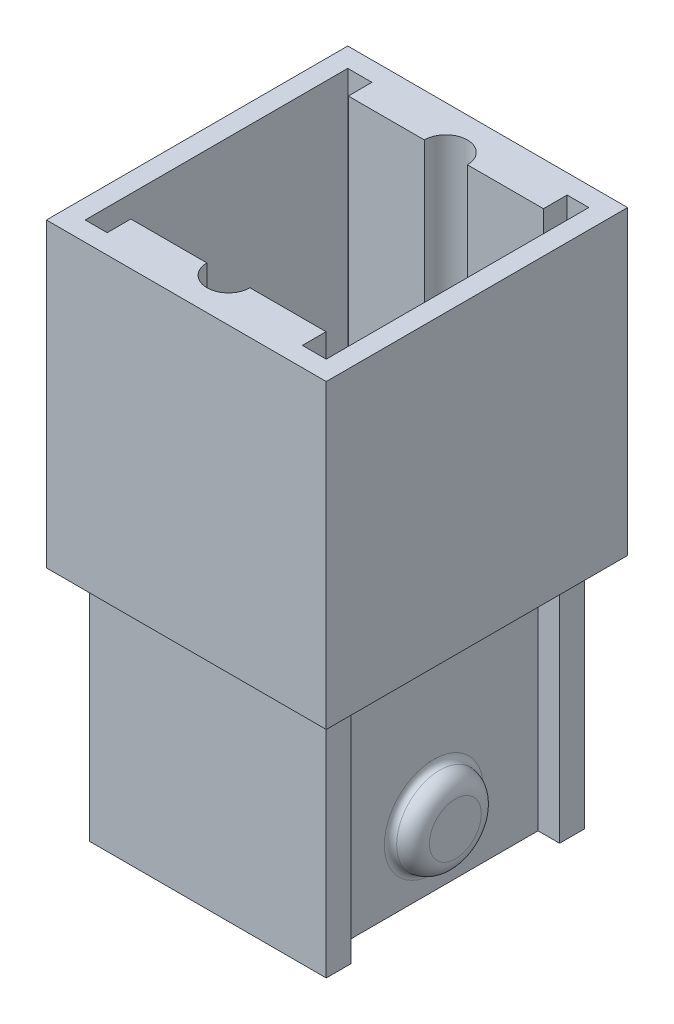
ISO-10303-21;
HEADER;
FILE_DESCRIPTION(('STEP AP214'),'2;1');
FILE_NAME('part.step','',(''),(''),'','','');
FILE_SCHEMA(('AUTOMOTIVE_DESIGN { 1 0 10303 214 1 1 1 1 }'));
ENDSEC;
DATA;
#1=APPLICATION_CONTEXT('core data for automotive mechanical design processes');
#2=APPLICATION_PROTOCOL_DEFINITION('international standard','automotive_design',2000,#1);
#3=PRODUCT_CONTEXT('',#1,'mechanical');
#4=PRODUCT('Part','Part','',(#3));
#5=PRODUCT_RELATED_PRODUCT_CATEGORY('part','',(#4));
#6=PRODUCT_DEFINITION_FORMATION('','',#4);
#7=PRODUCT_DEFINITION_CONTEXT('part definition',#1,'design');
#8=PRODUCT_DEFINITION('design','',#6,#7);
#9=PRODUCT_DEFINITION_SHAPE('','',#8);
#10=(LENGTH_UNIT() NAMED_UNIT(*) SI_UNIT(.MILLI.,.METRE.));
#11=(NAMED_UNIT(*) PLANE_ANGLE_UNIT() SI_UNIT($,.RADIAN.));
#12=(NAMED_UNIT(*) SI_UNIT($,.STERADIAN.) SOLID_ANGLE_UNIT());
#13=UNCERTAINTY_MEASURE_WITH_UNIT(LENGTH_MEASURE(1.E-05),#10,'distance_accuracy_value','');
#14=(GEOMETRIC_REPRESENTATION_CONTEXT(3) GLOBAL_UNCERTAINTY_ASSIGNED_CONTEXT((#13)) GLOBAL_UNIT_ASSIGNED_CONTEXT((#10,
#11,#12)) REPRESENTATION_CONTEXT('',''));
#15=CARTESIAN_POINT('',(0.,0.,0.));
#16=DIRECTION('',(0.,0.,1.));
#17=DIRECTION('',(1.,0.,0.));
#18=AXIS2_PLACEMENT_3D('',#15,#16,#17);
#19=CARTESIAN_POINT('',(5.04572989807048,6.5,-5.5));
#20=DIRECTION('',(0.,0.,-1.));
#21=DIRECTION('',(-1.,0.,0.));
#22=AXIS2_PLACEMENT_3D('',#19,#20,#21);
#23=PLANE('',#22);
#24=DIRECTION('',(-1.,0.,0.));
#25=VECTOR('',#24,1.);
#26=CARTESIAN_POINT('',(5.04572989807048,6.5,-5.5));
#27=LINE('',#26,#25);
#28=CARTESIAN_POINT('',(2.27869662372588,6.5,-5.5));
#29=VERTEX_POINT('',#28);
#30=CARTESIAN_POINT('',(0.511663349381284,6.5,-5.5));
#31=VERTEX_POINT('',#30);
#32=EDGE_CURVE('E299',#29,#31,#27,.T.);
#33=ORIENTED_EDGE('',*,*,#32,.F.);
#34=DIRECTION('',(0.,1.,0.));
#35=VECTOR('',#34,1.);
#36=CARTESIAN_POINT('',(2.27869662372588,6.5,-5.5));
#37=LINE('',#36,#35);
#38=CARTESIAN_POINT('',(2.27869662372588,12.5,-5.5));
#39=VERTEX_POINT('',#38);
#40=EDGE_CURVE('E316',#29,#39,#37,.T.);
#41=ORIENTED_EDGE('',*,*,#40,.T.);
#42=DIRECTION('',(-1.,0.,0.));
#43=VECTOR('',#42,1.);
#44=CARTESIAN_POINT('',(5.04572989807048,12.5,-5.5));
#45=LINE('',#44,#43);
#46=CARTESIAN_POINT('',(0.511663349381284,12.5,-5.5));
#47=VERTEX_POINT('',#46);
#48=EDGE_CURVE('E347',#39,#47,#45,.T.);
#49=ORIENTED_EDGE('',*,*,#48,.T.);
#50=DIRECTION('',(0.,1.,0.));
#51=VECTOR('',#50,1.);
#52=CARTESIAN_POINT('',(0.511663349381284,6.5,-5.5));
#53=LINE('',#52,#51);
#54=EDGE_CURVE('E368',#31,#47,#53,.T.);
#55=ORIENTED_EDGE('',*,*,#54,.F.);
#56=EDGE_LOOP('',(#33,#41,#49,#55));
#57=FACE_BOUND('',#56,.T.);
#58=ADVANCED_FACE('F40',(#57),#23,.F.);
#59=CARTESIAN_POINT('',(0.461663349381285,6.5,-0.5));
#60=DIRECTION('',(0.,0.,1.));
#61=DIRECTION('',(1.,0.,0.));
#62=AXIS2_PLACEMENT_3D('',#59,#60,#61);
#63=PLANE('',#62);
#64=DIRECTION('',(1.,0.,0.));
#65=VECTOR('',#64,1.);
#66=CARTESIAN_POINT('',(0.461663349381285,6.5,-0.5));
#67=LINE('',#66,#65);
#68=CARTESIAN_POINT('',(3.22869662372588,6.5,-0.5));
#69=VERTEX_POINT('',#68);
#70=CARTESIAN_POINT('',(4.99572989807048,6.5,-0.5));
#71=VERTEX_POINT('',#70);
#72=EDGE_CURVE('E274',#69,#71,#67,.T.);
#73=ORIENTED_EDGE('',*,*,#72,.F.);
#74=DIRECTION('',(0.,1.,0.));
#75=VECTOR('',#74,1.);
#76=CARTESIAN_POINT('',(3.22869662372588,6.5,-0.5));
#77=LINE('',#76,#75);
#78=CARTESIAN_POINT('',(3.22869662372588,12.5,-0.5));
#79=VERTEX_POINT('',#78);
#80=EDGE_CURVE('E252',#69,#79,#77,.T.);
#81=ORIENTED_EDGE('',*,*,#80,.T.);
#82=DIRECTION('',(1.,0.,0.));
#83=VECTOR('',#82,1.);
#84=CARTESIAN_POINT('',(0.461663349381285,12.5,-0.5));
#85=LINE('',#84,#83);
#86=CARTESIAN_POINT('',(4.99572989807048,12.5,-0.5));
#87=VERTEX_POINT('',#86);
#88=EDGE_CURVE('E324',#79,#87,#85,.T.);
#89=ORIENTED_EDGE('',*,*,#88,.T.);
#90=DIRECTION('',(0.,1.,0.));
#91=VECTOR('',#90,1.);
#92=CARTESIAN_POINT('',(4.99572989807048,6.5,-0.5));
#93=LINE('',#92,#91);
#94=EDGE_CURVE('E387',#71,#87,#93,.T.);
#95=ORIENTED_EDGE('',*,*,#94,.F.);
#96=EDGE_LOOP('',(#73,#81,#89,#95));
#97=FACE_BOUND('',#96,.T.);
#98=ADVANCED_FACE('F610',(#97),#63,.F.);
#99=CARTESIAN_POINT('',(0.,12.5,0.));
#100=DIRECTION('',(1.,0.,0.));
#101=DIRECTION('',(0.,0.,-1.));
#102=AXIS2_PLACEMENT_3D('',#99,#100,#101);
#103=PLANE('',#102);
#104=DIRECTION('',(0.,0.,1.));
#105=VECTOR('',#104,1.);
#106=CARTESIAN_POINT('',(0.,5.5,0.));
#107=LINE('',#106,#105);
#108=CARTESIAN_POINT('',(0.,5.5,-6.));
#109=VERTEX_POINT('',#108);
#110=CARTESIAN_POINT('',(0.,5.5,-5.42));
#111=VERTEX_POINT('',#110);
#112=EDGE_CURVE('E455',#109,#111,#107,.T.);
#113=ORIENTED_EDGE('',*,*,#112,.F.);
#114=DIRECTION('',(0.,-1.,0.));
#115=VECTOR('',#114,1.);
#116=CARTESIAN_POINT('',(0.,12.5,-6.));
#117=LINE('',#116,#115);
#118=CARTESIAN_POINT('',(0.,0.,-6.));
#119=VERTEX_POINT('',#118);
#120=EDGE_CURVE('E560',#109,#119,#117,.T.);
#121=ORIENTED_EDGE('',*,*,#120,.T.);
#122=DIRECTION('',(0.,0.,1.));
#123=VECTOR('',#122,1.);
#124=CARTESIAN_POINT('',(0.,0.,0.));
#125=LINE('',#124,#123);
#126=CARTESIAN_POINT('',(0.,0.,-5.42));
#127=VERTEX_POINT('',#126);
#128=EDGE_CURVE('E543',#119,#127,#125,.T.);
#129=ORIENTED_EDGE('',*,*,#128,.T.);
#130=DIRECTION('',(0.,1.,0.));
#131=VECTOR('',#130,1.);
#132=CARTESIAN_POINT('',(0.,0.,-5.42));
#133=LINE('',#132,#131);
#134=EDGE_CURVE('E502',#127,#111,#133,.T.);
#135=ORIENTED_EDGE('',*,*,#134,.T.);
#136=EDGE_LOOP('',(#113,#121,#129,#135));
#137=FACE_BOUND('',#136,.T.);
#138=ADVANCED_FACE('F618',(#137),#103,.F.);
#139=CARTESIAN_POINT('',(5.5,12.5,0.));
#140=DIRECTION('',(-1.,0.,0.));
#141=DIRECTION('',(0.,0.,1.));
#142=AXIS2_PLACEMENT_3D('',#139,#140,#141);
#143=PLANE('',#142);
#144=DIRECTION('',(0.,0.,-1.));
#145=VECTOR('',#144,1.);
#146=CARTESIAN_POINT('',(5.5,5.5,0.));
#147=LINE('',#146,#145);
#148=CARTESIAN_POINT('',(5.5,5.5,0.));
#149=VERTEX_POINT('',#148);
#150=CARTESIAN_POINT('',(5.5,5.5,-0.58));
#151=VERTEX_POINT('',#150);
#152=EDGE_CURVE('E471',#149,#151,#147,.T.);
#153=ORIENTED_EDGE('',*,*,#152,.F.);
#154=DIRECTION('',(0.,-1.,0.));
#155=VECTOR('',#154,1.);
#156=CARTESIAN_POINT('',(5.5,12.5,0.));
#157=LINE('',#156,#155);
#158=CARTESIAN_POINT('',(5.5,0.,0.));
#159=VERTEX_POINT('',#158);
#160=EDGE_CURVE('E566',#149,#159,#157,.T.);
#161=ORIENTED_EDGE('',*,*,#160,.T.);
#162=DIRECTION('',(0.,0.,-1.));
#163=VECTOR('',#162,1.);
#164=CARTESIAN_POINT('',(5.5,0.,0.));
#165=LINE('',#164,#163);
#166=CARTESIAN_POINT('',(5.5,0.,-0.58));
#167=VERTEX_POINT('',#166);
#168=EDGE_CURVE('E552',#159,#167,#165,.T.);
#169=ORIENTED_EDGE('',*,*,#168,.T.);
#170=DIRECTION('',(0.,1.,0.));
#171=VECTOR('',#170,1.);
#172=CARTESIAN_POINT('',(5.5,0.,-0.58));
#173=LINE('',#172,#171);
#174=EDGE_CURVE('E493',#167,#151,#173,.T.);
#175=ORIENTED_EDGE('',*,*,#174,.T.);
#176=EDGE_LOOP('',(#153,#161,#169,#175));
#177=FACE_BOUND('',#176,.T.);
#178=ADVANCED_FACE('F772',(#177),#143,.F.);
#179=DIRECTION('',(0.,0.,1.));
#180=VECTOR('',#179,1.);
#181=CARTESIAN_POINT('',(0.,5.5,0.));
#182=LINE('',#181,#180);
#183=CARTESIAN_POINT('',(0.,5.5,-0.58));
#184=VERTEX_POINT('',#183);
#185=CARTESIAN_POINT('',(0.,5.5,0.));
#186=VERTEX_POINT('',#185);
#187=EDGE_CURVE('E451',#184,#186,#182,.T.);
#188=ORIENTED_EDGE('',*,*,#187,.F.);
#189=DIRECTION('',(0.,1.,0.));
#190=VECTOR('',#189,1.);
#191=CARTESIAN_POINT('',(0.,0.,-0.58));
#192=LINE('',#191,#190);
#193=CARTESIAN_POINT('',(0.,0.,-0.58));
#194=VERTEX_POINT('',#193);
#195=EDGE_CURVE('E501',#194,#184,#192,.T.);
#196=ORIENTED_EDGE('',*,*,#195,.F.);
#197=CARTESIAN_POINT('',(0.,0.,0.));
#198=VERTEX_POINT('',#197);
#199=EDGE_CURVE('E506',#194,#198,#125,.T.);
#200=ORIENTED_EDGE('',*,*,#199,.T.);
#201=DIRECTION('',(0.,-1.,0.));
#202=VECTOR('',#201,1.);
#203=CARTESIAN_POINT('',(0.,12.5,0.));
#204=LINE('',#203,#202);
#205=EDGE_CURVE('E569',#186,#198,#204,.T.);
#206=ORIENTED_EDGE('',*,*,#205,.F.);
#207=EDGE_LOOP('',(#188,#196,#200,#206));
#208=FACE_BOUND('',#207,.T.);
#209=ADVANCED_FACE('F775',(#208),#103,.F.);
#210=CARTESIAN_POINT('',(0.,12.5,0.));
#211=DIRECTION('',(0.,0.,-1.));
#212=DIRECTION('',(-1.,0.,0.));
#213=AXIS2_PLACEMENT_3D('',#210,#211,#212);
#214=PLANE('',#213);
#215=DIRECTION('',(1.,0.,0.));
#216=VECTOR('',#215,1.);
#217=CARTESIAN_POINT('',(0.,5.5,0.));
#218=LINE('',#217,#216);
#219=EDGE_CURVE('E467',#186,#149,#218,.T.);
#220=ORIENTED_EDGE('',*,*,#219,.F.);
#221=ORIENTED_EDGE('',*,*,#205,.T.);
#222=DIRECTION('',(1.,0.,0.));
#223=VECTOR('',#222,1.);
#224=CARTESIAN_POINT('',(0.,0.,0.));
#225=LINE('',#224,#223);
#226=EDGE_CURVE('E547',#198,#159,#225,.T.);
#227=ORIENTED_EDGE('',*,*,#226,.T.);
#228=ORIENTED_EDGE('',*,*,#160,.F.);
#229=EDGE_LOOP('',(#220,#221,#227,#228));
#230=FACE_BOUND('',#229,.T.);
#231=ADVANCED_FACE('F777',(#230),#214,.F.);
#232=DIRECTION('',(0.,0.,-1.));
#233=VECTOR('',#232,1.);
#234=CARTESIAN_POINT('',(5.5,5.5,0.));
#235=LINE('',#234,#233);
#236=CARTESIAN_POINT('',(5.5,5.5,-5.42));
#237=VERTEX_POINT('',#236);
#238=CARTESIAN_POINT('',(5.5,5.5,-6.));
#239=VERTEX_POINT('',#238);
#240=EDGE_CURVE('E463',#237,#239,#235,.T.);
#241=ORIENTED_EDGE('',*,*,#240,.F.);
#242=DIRECTION('',(0.,1.,0.));
#243=VECTOR('',#242,1.);
#244=CARTESIAN_POINT('',(5.5,0.,-5.42));
#245=LINE('',#244,#243);
#246=CARTESIAN_POINT('',(5.5,0.,-5.42));
#247=VERTEX_POINT('',#246);
#248=EDGE_CURVE('E528',#247,#237,#245,.T.);
#249=ORIENTED_EDGE('',*,*,#248,.F.);
#250=CARTESIAN_POINT('',(5.5,0.,-6.));
#251=VERTEX_POINT('',#250);
#252=EDGE_CURVE('E551',#247,#251,#165,.T.);
#253=ORIENTED_EDGE('',*,*,#252,.T.);
#254=DIRECTION('',(0.,-1.,0.));
#255=VECTOR('',#254,1.);
#256=CARTESIAN_POINT('',(5.5,12.5,-6.));
#257=LINE('',#256,#255);
#258=EDGE_CURVE('E563',#239,#251,#257,.T.);
#259=ORIENTED_EDGE('',*,*,#258,.F.);
#260=EDGE_LOOP('',(#241,#249,#253,#259));
#261=FACE_BOUND('',#260,.T.);
#262=ADVANCED_FACE('F770',(#261),#143,.F.);
#263=CARTESIAN_POINT('',(0.,12.5,-6.));
#264=DIRECTION('',(0.,0.,1.));
#265=DIRECTION('',(1.,0.,0.));
#266=AXIS2_PLACEMENT_3D('',#263,#264,#265);
#267=PLANE('',#266);
#268=DIRECTION('',(-1.,0.,0.));
#269=VECTOR('',#268,1.);
#270=CARTESIAN_POINT('',(0.,5.5,-6.));
#271=LINE('',#270,#269);
#272=EDGE_CURVE('E459',#239,#109,#271,.T.);
#273=ORIENTED_EDGE('',*,*,#272,.F.);
#274=ORIENTED_EDGE('',*,*,#258,.T.);
#275=DIRECTION('',(-1.,0.,0.));
#276=VECTOR('',#275,1.);
#277=CARTESIAN_POINT('',(0.,0.,-6.));
#278=LINE('',#277,#276);
#279=EDGE_CURVE('E556',#251,#119,#278,.T.);
#280=ORIENTED_EDGE('',*,*,#279,.T.);
#281=ORIENTED_EDGE('',*,*,#120,.F.);
#282=EDGE_LOOP('',(#273,#274,#280,#281));
#283=FACE_BOUND('',#282,.T.);
#284=ADVANCED_FACE('F755',(#283),#267,.F.);
#285=CARTESIAN_POINT('',(5.5,0.,-0.58));
#286=DIRECTION('',(0.,0.,1.));
#287=DIRECTION('',(1.,0.,0.));
#288=AXIS2_PLACEMENT_3D('',#285,#286,#287);
#289=PLANE('',#288);
#290=DIRECTION('',(-1.,0.,0.));
#291=VECTOR('',#290,1.);
#292=CARTESIAN_POINT('',(5.5,5.5,-0.58));
#293=LINE('',#292,#291);
#294=CARTESIAN_POINT('',(5.,5.5,-0.58));
#295=VERTEX_POINT('',#294);
#296=EDGE_CURVE('E483',#151,#295,#293,.T.);
#297=ORIENTED_EDGE('',*,*,#296,.F.);
#298=ORIENTED_EDGE('',*,*,#174,.F.);
#299=DIRECTION('',(1.,0.,0.));
#300=VECTOR('',#299,1.);
#301=CARTESIAN_POINT('',(5.5,0.,-0.58));
#302=LINE('',#301,#300);
#303=CARTESIAN_POINT('',(5.,0.,-0.58));
#304=VERTEX_POINT('',#303);
#305=EDGE_CURVE('E524',#304,#167,#302,.T.);
#306=ORIENTED_EDGE('',*,*,#305,.F.);
#307=DIRECTION('',(0.,1.,0.));
#308=VECTOR('',#307,1.);
#309=CARTESIAN_POINT('',(5.,0.,-0.58));
#310=LINE('',#309,#308);
#311=EDGE_CURVE('E532',#304,#295,#310,.T.);
#312=ORIENTED_EDGE('',*,*,#311,.T.);
#313=EDGE_LOOP('',(#297,#298,#306,#312));
#314=FACE_BOUND('',#313,.T.);
#315=ADVANCED_FACE('F751',(#314),#289,.F.);
#316=CARTESIAN_POINT('',(5.,0.,-5.42));
#317=DIRECTION('',(-1.,0.,0.));
#318=DIRECTION('',(0.,0.,1.));
#319=AXIS2_PLACEMENT_3D('',#316,#317,#318);
#320=PLANE('',#319);
#321=CARTESIAN_POINT('',(5.,1.5,-3.));
#322=DIRECTION('',(-1.,0.,0.));
#323=DIRECTION('',(0.,0.,1.));
#324=AXIS2_PLACEMENT_3D('',#321,#322,#323);
#325=CIRCLE('',#324,1.15);
#326=CARTESIAN_POINT('',(5.,1.5,-1.85));
#327=VERTEX_POINT('',#326);
#328=EDGE_CURVE('E572',#327,#327,#325,.T.);
#329=ORIENTED_EDGE('',*,*,#328,.T.);
#330=EDGE_LOOP('',(#329));
#331=FACE_BOUND('',#330,.T.);
#332=DIRECTION('',(0.,0.,-1.));
#333=VECTOR('',#332,1.);
#334=CARTESIAN_POINT('',(5.,5.5,-5.42));
#335=LINE('',#334,#333);
#336=CARTESIAN_POINT('',(5.,5.5,-5.42));
#337=VERTEX_POINT('',#336);
#338=EDGE_CURVE('E479',#295,#337,#335,.T.);
#339=ORIENTED_EDGE('',*,*,#338,.F.);
#340=ORIENTED_EDGE('',*,*,#311,.F.);
#341=DIRECTION('',(0.,0.,1.));
#342=VECTOR('',#341,1.);
#343=CARTESIAN_POINT('',(5.,0.,-5.42));
#344=LINE('',#343,#342);
#345=CARTESIAN_POINT('',(5.,0.,-5.42));
#346=VERTEX_POINT('',#345);
#347=EDGE_CURVE('E520',#346,#304,#344,.T.);
#348=ORIENTED_EDGE('',*,*,#347,.F.);
#349=DIRECTION('',(0.,1.,0.));
#350=VECTOR('',#349,1.);
#351=CARTESIAN_POINT('',(5.,0.,-5.42));
#352=LINE('',#351,#350);
#353=EDGE_CURVE('E536',#346,#337,#352,.T.);
#354=ORIENTED_EDGE('',*,*,#353,.T.);
#355=EDGE_LOOP('',(#339,#340,#348,#354));
#356=FACE_BOUND('',#355,.T.);
#357=ADVANCED_FACE('F754',(#331,#356),#320,.F.);
#358=CARTESIAN_POINT('',(5.5,0.,-5.42));
#359=DIRECTION('',(0.,0.,-1.));
#360=DIRECTION('',(-1.,0.,0.));
#361=AXIS2_PLACEMENT_3D('',#358,#359,#360);
#362=PLANE('',#361);
#363=DIRECTION('',(1.,0.,0.));
#364=VECTOR('',#363,1.);
#365=CARTESIAN_POINT('',(5.5,5.5,-5.42));
#366=LINE('',#365,#364);
#367=EDGE_CURVE('E475',#337,#237,#366,.T.);
#368=ORIENTED_EDGE('',*,*,#367,.F.);
#369=ORIENTED_EDGE('',*,*,#353,.F.);
#370=DIRECTION('',(-1.,0.,0.));
#371=VECTOR('',#370,1.);
#372=CARTESIAN_POINT('',(5.5,0.,-5.42));
#373=LINE('',#372,#371);
#374=EDGE_CURVE('E487',#247,#346,#373,.T.);
#375=ORIENTED_EDGE('',*,*,#374,.F.);
#376=ORIENTED_EDGE('',*,*,#248,.T.);
#377=EDGE_LOOP('',(#368,#369,#375,#376));
#378=FACE_BOUND('',#377,.T.);
#379=ADVANCED_FACE('F742',(#378),#362,.F.);
#380=CARTESIAN_POINT('',(0.,0.,-5.42));
#381=DIRECTION('',(0.,0.,-1.));
#382=DIRECTION('',(-1.,0.,0.));
#383=AXIS2_PLACEMENT_3D('',#380,#381,#382);
#384=PLANE('',#383);
#385=DIRECTION('',(1.,0.,0.));
#386=VECTOR('',#385,1.);
#387=CARTESIAN_POINT('',(0.,5.5,-5.42));
#388=LINE('',#387,#386);
#389=CARTESIAN_POINT('',(0.5,5.5,-5.42));
#390=VERTEX_POINT('',#389);
#391=EDGE_CURVE('E447',#111,#390,#388,.T.);
#392=ORIENTED_EDGE('',*,*,#391,.F.);
#393=ORIENTED_EDGE('',*,*,#134,.F.);
#394=DIRECTION('',(-1.,0.,0.));
#395=VECTOR('',#394,1.);
#396=CARTESIAN_POINT('',(0.,0.,-5.42));
#397=LINE('',#396,#395);
#398=CARTESIAN_POINT('',(0.5,0.,-5.42));
#399=VERTEX_POINT('',#398);
#400=EDGE_CURVE('E497',#399,#127,#397,.T.);
#401=ORIENTED_EDGE('',*,*,#400,.F.);
#402=DIRECTION('',(0.,1.,0.));
#403=VECTOR('',#402,1.);
#404=CARTESIAN_POINT('',(0.5,0.,-5.42));
#405=LINE('',#404,#403);
#406=EDGE_CURVE('E507',#399,#390,#405,.T.);
#407=ORIENTED_EDGE('',*,*,#406,.T.);
#408=EDGE_LOOP('',(#392,#393,#401,#407));
#409=FACE_BOUND('',#408,.T.);
#410=ADVANCED_FACE('F738',(#409),#384,.F.);
#411=CARTESIAN_POINT('',(0.5,0.,-5.42));
#412=DIRECTION('',(1.,0.,0.));
#413=DIRECTION('',(0.,0.,-1.));
#414=AXIS2_PLACEMENT_3D('',#411,#412,#413);
#415=PLANE('',#414);
#416=CARTESIAN_POINT('',(0.5,1.5,-3.01708132364636));
#417=DIRECTION('',(1.,0.,0.));
#418=DIRECTION('',(0.,0.,-1.));
#419=AXIS2_PLACEMENT_3D('',#416,#417,#418);
#420=CIRCLE('',#419,1.1);
#421=CARTESIAN_POINT('',(0.5,1.5,-4.11708132364636));
#422=VERTEX_POINT('',#421);
#423=EDGE_CURVE('E588',#422,#422,#420,.T.);
#424=ORIENTED_EDGE('',*,*,#423,.T.);
#425=EDGE_LOOP('',(#424));
#426=FACE_BOUND('',#425,.T.);
#427=DIRECTION('',(0.,0.,1.));
#428=VECTOR('',#427,1.);
#429=CARTESIAN_POINT('',(0.5,5.5,-5.42));
#430=LINE('',#429,#428);
#431=CARTESIAN_POINT('',(0.500000000000001,5.5,-0.58));
#432=VERTEX_POINT('',#431);
#433=EDGE_CURVE('E435',#390,#432,#430,.T.);
#434=ORIENTED_EDGE('',*,*,#433,.F.);
#435=ORIENTED_EDGE('',*,*,#406,.F.);
#436=DIRECTION('',(0.,0.,-1.));
#437=VECTOR('',#436,1.);
#438=CARTESIAN_POINT('',(0.5,0.,-5.42));
#439=LINE('',#438,#437);
#440=CARTESIAN_POINT('',(0.500000000000001,0.,-0.58));
#441=VERTEX_POINT('',#440);
#442=EDGE_CURVE('E492',#441,#399,#439,.T.);
#443=ORIENTED_EDGE('',*,*,#442,.F.);
#444=DIRECTION('',(0.,1.,0.));
#445=VECTOR('',#444,1.);
#446=CARTESIAN_POINT('',(0.500000000000001,0.,-0.58));
#447=LINE('',#446,#445);
#448=EDGE_CURVE('E511',#441,#432,#447,.T.);
#449=ORIENTED_EDGE('',*,*,#448,.T.);
#450=EDGE_LOOP('',(#434,#435,#443,#449));
#451=FACE_BOUND('',#450,.T.);
#452=ADVANCED_FACE('F741',(#426,#451),#415,.F.);
#453=CARTESIAN_POINT('',(0.,0.,-0.58));
#454=DIRECTION('',(0.,0.,1.));
#455=DIRECTION('',(1.,0.,0.));
#456=AXIS2_PLACEMENT_3D('',#453,#454,#455);
#457=PLANE('',#456);
#458=DIRECTION('',(-1.,0.,0.));
#459=VECTOR('',#458,1.);
#460=CARTESIAN_POINT('',(0.,5.5,-0.58));
#461=LINE('',#460,#459);
#462=EDGE_CURVE('E11',#432,#184,#461,.T.);
#463=ORIENTED_EDGE('',*,*,#462,.F.);
#464=ORIENTED_EDGE('',*,*,#448,.F.);
#465=DIRECTION('',(1.,0.,0.));
#466=VECTOR('',#465,1.);
#467=CARTESIAN_POINT('',(0.,0.,-0.58));
#468=LINE('',#467,#466);
#469=EDGE_CURVE('E488',#194,#441,#468,.T.);
#470=ORIENTED_EDGE('',*,*,#469,.F.);
#471=ORIENTED_EDGE('',*,*,#195,.T.);
#472=EDGE_LOOP('',(#463,#464,#470,#471));
#473=FACE_BOUND('',#472,.T.);
#474=ADVANCED_FACE('F746',(#473),#457,.F.);
#475=CARTESIAN_POINT('',(0.,0.,0.));
#476=DIRECTION('',(0.,-1.,0.));
#477=DIRECTION('',(0.,0.,-1.));
#478=AXIS2_PLACEMENT_3D('',#475,#476,#477);
#479=PLANE('',#478);
#480=ORIENTED_EDGE('',*,*,#400,.T.);
#481=ORIENTED_EDGE('',*,*,#128,.F.);
#482=ORIENTED_EDGE('',*,*,#279,.F.);
#483=ORIENTED_EDGE('',*,*,#252,.F.);
#484=ORIENTED_EDGE('',*,*,#374,.T.);
#485=ORIENTED_EDGE('',*,*,#347,.T.);
#486=ORIENTED_EDGE('',*,*,#305,.T.);
#487=ORIENTED_EDGE('',*,*,#168,.F.);
#488=ORIENTED_EDGE('',*,*,#226,.F.);
#489=ORIENTED_EDGE('',*,*,#199,.F.);
#490=ORIENTED_EDGE('',*,*,#469,.T.);
#491=ORIENTED_EDGE('',*,*,#442,.T.);
#492=EDGE_LOOP('',(#480,#481,#482,#483,#484,#485,#486,#487,#488,#489,#490,#491));
#493=FACE_BOUND('',#492,.T.);
#494=ADVANCED_FACE('F736',(#493),#479,.T.);
#495=CARTESIAN_POINT('',(5.5,1.5,-3.));
#496=DIRECTION('',(1.,0.,0.));
#497=DIRECTION('',(0.,0.,-1.));
#498=AXIS2_PLACEMENT_3D('',#495,#496,#497);
#499=PLANE('',#498);
#500=CARTESIAN_POINT('',(5.5,1.5,-3.));
#501=DIRECTION('',(1.,0.,0.));
#502=DIRECTION('',(0.,0.,-1.));
#503=AXIS2_PLACEMENT_3D('',#500,#501,#502);
#504=CIRCLE('',#503,0.602277442494834);
#505=CARTESIAN_POINT('',(5.5,1.5,-3.60227744249483));
#506=VERTEX_POINT('',#505);
#507=EDGE_CURVE('E576',#506,#506,#504,.T.);
#508=ORIENTED_EDGE('',*,*,#507,.T.);
#509=EDGE_LOOP('',(#508));
#510=FACE_BOUND('',#509,.T.);
#511=ADVANCED_FACE('F732',(#510),#499,.T.);
#512=CARTESIAN_POINT('',(5.15,1.5,-3.));
#513=DIRECTION('',(-1.,0.,0.));
#514=DIRECTION('',(0.,0.,1.));
#515=AXIS2_PLACEMENT_3D('',#512,#513,#514);
#516=TOROIDAL_SURFACE('',#515,1.15,0.15);
#517=CARTESIAN_POINT('',(5.13636363636364,1.5,-3.));
#518=DIRECTION('',(1.,0.,0.));
#519=DIRECTION('',(0.,0.,-1.));
#520=AXIS2_PLACEMENT_3D('',#517,#518,#519);
#521=CIRCLE('',#520,1.00062112068041);
#522=CARTESIAN_POINT('',(5.13636363636364,1.5,-4.00062112068041));
#523=VERTEX_POINT('',#522);
#524=EDGE_CURVE('E580',#523,#523,#521,.F.);
#525=ORIENTED_EDGE('',*,*,#524,.T.);
#526=EDGE_LOOP('',(#525));
#527=FACE_BOUND('',#526,.T.);
#528=ORIENTED_EDGE('',*,*,#328,.F.);
#529=EDGE_LOOP('',(#528));
#530=FACE_BOUND('',#529,.T.);
#531=ADVANCED_FACE('F735',(#527,#530),#516,.F.);
#532=CARTESIAN_POINT('',(5.1,1.5,-3.));
#533=DIRECTION('',(-1.,0.,0.));
#534=DIRECTION('',(0.,0.,1.));
#535=AXIS2_PLACEMENT_3D('',#532,#533,#534);
#536=TOROIDAL_SURFACE('',#535,0.602277442494834,0.4);
#537=ORIENTED_EDGE('',*,*,#524,.F.);
#538=EDGE_LOOP('',(#537));
#539=FACE_BOUND('',#538,.T.);
#540=ORIENTED_EDGE('',*,*,#507,.F.);
#541=EDGE_LOOP('',(#540));
#542=FACE_BOUND('',#541,.T.);
#543=ADVANCED_FACE('F731',(#539,#542),#536,.T.);
#544=CARTESIAN_POINT('',(0.,1.5,-3.01708132364636));
#545=DIRECTION('',(-1.,0.,0.));
#546=DIRECTION('',(0.,0.,1.));
#547=AXIS2_PLACEMENT_3D('',#544,#545,#546);
#548=PLANE('',#547);
#549=CARTESIAN_POINT('',(0.,1.5,-3.01708132364636));
#550=DIRECTION('',(-1.,0.,0.));
#551=DIRECTION('',(0.,0.,1.));
#552=AXIS2_PLACEMENT_3D('',#549,#550,#551);
#553=CIRCLE('',#552,0.6);
#554=CARTESIAN_POINT('',(0.,1.5,-2.41708132364636));
#555=VERTEX_POINT('',#554);
#556=EDGE_CURVE('E49',#555,#555,#553,.T.);
#557=ORIENTED_EDGE('',*,*,#556,.T.);
#558=EDGE_LOOP('',(#557));
#559=FACE_BOUND('',#558,.T.);
#560=ADVANCED_FACE('F595',(#559),#548,.T.);
#561=CARTESIAN_POINT('',(0.4,1.5,-3.01708132364636));
#562=DIRECTION('',(1.,0.,0.));
#563=DIRECTION('',(0.,0.,-1.));
#564=AXIS2_PLACEMENT_3D('',#561,#562,#563);
#565=TOROIDAL_SURFACE('',#564,1.1,0.1);
#566=ORIENTED_EDGE('',*,*,#423,.F.);
#567=EDGE_LOOP('',(#566));
#568=FACE_BOUND('',#567,.T.);
#569=CARTESIAN_POINT('',(0.4,1.5,-3.01708132364636));
#570=DIRECTION('',(1.,0.,0.));
#571=DIRECTION('',(0.,0.,-1.));
#572=AXIS2_PLACEMENT_3D('',#569,#570,#571);
#573=CIRCLE('',#572,1.);
#574=CARTESIAN_POINT('',(0.4,1.5,-4.01708132364636));
#575=VERTEX_POINT('',#574);
#576=EDGE_CURVE('E584',#575,#575,#573,.F.);
#577=ORIENTED_EDGE('',*,*,#576,.F.);
#578=EDGE_LOOP('',(#577));
#579=FACE_BOUND('',#578,.T.);
#580=ADVANCED_FACE('F599',(#568,#579),#565,.F.);
#581=CARTESIAN_POINT('',(0.4,1.5,-3.01708132364636));
#582=DIRECTION('',(-1.,0.,0.));
#583=DIRECTION('',(0.,0.,1.));
#584=AXIS2_PLACEMENT_3D('',#581,#582,#583);
#585=TOROIDAL_SURFACE('',#584,0.6,0.4);
#586=ORIENTED_EDGE('',*,*,#576,.T.);
#587=EDGE_LOOP('',(#586));
#588=FACE_BOUND('',#587,.T.);
#589=ORIENTED_EDGE('',*,*,#556,.F.);
#590=EDGE_LOOP('',(#589));
#591=FACE_BOUND('',#590,.T.);
#592=ADVANCED_FACE('F42',(#588,#591),#585,.T.);
#593=CARTESIAN_POINT('',(0.,5.5,0.));
#594=DIRECTION('',(0.,1.,0.));
#595=DIRECTION('',(0.,0.,1.));
#596=AXIS2_PLACEMENT_3D('',#593,#594,#595);
#597=PLANE('',#596);
#598=DIRECTION('',(0.,0.,1.));
#599=VECTOR('',#598,1.);
#600=CARTESIAN_POINT('',(-0.5,5.5,-6.5));
#601=LINE('',#600,#599);
#602=CARTESIAN_POINT('',(-0.5,5.5,-6.5));
#603=VERTEX_POINT('',#602);
#604=CARTESIAN_POINT('',(-0.499999999999999,5.5,0.5));
#605=VERTEX_POINT('',#604);
#606=EDGE_CURVE('E400',#603,#605,#601,.T.);
#607=ORIENTED_EDGE('',*,*,#606,.F.);
#608=DIRECTION('',(-1.,0.,0.));
#609=VECTOR('',#608,1.);
#610=CARTESIAN_POINT('',(-0.5,5.5,-6.5));
#611=LINE('',#610,#609);
#612=CARTESIAN_POINT('',(6.,5.5,-6.5));
#613=VERTEX_POINT('',#612);
#614=EDGE_CURVE('E413',#613,#603,#611,.T.);
#615=ORIENTED_EDGE('',*,*,#614,.F.);
#616=DIRECTION('',(0.,0.,-1.));
#617=VECTOR('',#616,1.);
#618=CARTESIAN_POINT('',(6.,5.5,-6.5));
#619=LINE('',#618,#617);
#620=CARTESIAN_POINT('',(6.,5.5,0.5));
#621=VERTEX_POINT('',#620);
#622=EDGE_CURVE('E409',#621,#613,#619,.T.);
#623=ORIENTED_EDGE('',*,*,#622,.F.);
#624=DIRECTION('',(1.,0.,0.));
#625=VECTOR('',#624,1.);
#626=CARTESIAN_POINT('',(-0.499999999999999,5.5,0.5));
#627=LINE('',#626,#625);
#628=EDGE_CURVE('E404',#605,#621,#627,.T.);
#629=ORIENTED_EDGE('',*,*,#628,.F.);
#630=EDGE_LOOP('',(#607,#615,#623,#629));
#631=FACE_BOUND('',#630,.T.);
#632=ORIENTED_EDGE('',*,*,#152,.T.);
#633=ORIENTED_EDGE('',*,*,#296,.T.);
#634=ORIENTED_EDGE('',*,*,#338,.T.);
#635=ORIENTED_EDGE('',*,*,#367,.T.);
#636=ORIENTED_EDGE('',*,*,#240,.T.);
#637=ORIENTED_EDGE('',*,*,#272,.T.);
#638=ORIENTED_EDGE('',*,*,#112,.T.);
#639=ORIENTED_EDGE('',*,*,#391,.T.);
#640=ORIENTED_EDGE('',*,*,#433,.T.);
#641=ORIENTED_EDGE('',*,*,#462,.T.);
#642=ORIENTED_EDGE('',*,*,#187,.T.);
#643=ORIENTED_EDGE('',*,*,#219,.T.);
#644=EDGE_LOOP('',(#632,#633,#634,#635,#636,#637,#638,#639,#640,#641,#642,#643));
#645=FACE_BOUND('',#644,.T.);
#646=ADVANCED_FACE('F598',(#631,#645),#597,.F.);
#647=CARTESIAN_POINT('',(-0.5,5.5,-6.5));
#648=DIRECTION('',(-1.,0.,0.));
#649=DIRECTION('',(0.,0.,1.));
#650=AXIS2_PLACEMENT_3D('',#647,#648,#649);
#651=PLANE('',#650);
#652=DIRECTION('',(0.,0.,1.));
#653=VECTOR('',#652,1.);
#654=CARTESIAN_POINT('',(-0.5,12.5,-6.5));
#655=LINE('',#654,#653);
#656=CARTESIAN_POINT('',(-0.5,12.5,-6.5));
#657=VERTEX_POINT('',#656);
#658=CARTESIAN_POINT('',(-0.499999999999999,12.5,0.5));
#659=VERTEX_POINT('',#658);
#660=EDGE_CURVE('E364',#657,#659,#655,.T.);
#661=ORIENTED_EDGE('',*,*,#660,.F.);
#662=DIRECTION('',(0.,1.,0.));
#663=VECTOR('',#662,1.);
#664=CARTESIAN_POINT('',(-0.5,5.5,-6.5));
#665=LINE('',#664,#663);
#666=EDGE_CURVE('E432',#603,#657,#665,.T.);
#667=ORIENTED_EDGE('',*,*,#666,.F.);
#668=ORIENTED_EDGE('',*,*,#606,.T.);
#669=DIRECTION('',(0.,1.,0.));
#670=VECTOR('',#669,1.);
#671=CARTESIAN_POINT('',(-0.499999999999999,5.5,0.5));
#672=LINE('',#671,#670);
#673=EDGE_CURVE('E417',#605,#659,#672,.T.);
#674=ORIENTED_EDGE('',*,*,#673,.T.);
#675=EDGE_LOOP('',(#661,#667,#668,#674));
#676=FACE_BOUND('',#675,.T.);
#677=ADVANCED_FACE('F605',(#676),#651,.T.);
#678=CARTESIAN_POINT('',(-0.5,5.5,-6.5));
#679=DIRECTION('',(0.,0.,-1.));
#680=DIRECTION('',(-1.,0.,0.));
#681=AXIS2_PLACEMENT_3D('',#678,#679,#680);
#682=PLANE('',#681);
#683=DIRECTION('',(-1.,0.,0.));
#684=VECTOR('',#683,1.);
#685=CARTESIAN_POINT('',(-0.5,12.5,-6.5));
#686=LINE('',#685,#684);
#687=CARTESIAN_POINT('',(6.,12.5,-6.5));
#688=VERTEX_POINT('',#687);
#689=EDGE_CURVE('E405',#688,#657,#686,.T.);
#690=ORIENTED_EDGE('',*,*,#689,.F.);
#691=DIRECTION('',(0.,1.,0.));
#692=VECTOR('',#691,1.);
#693=CARTESIAN_POINT('',(6.,5.5,-6.5));
#694=LINE('',#693,#692);
#695=EDGE_CURVE('E436',#613,#688,#694,.T.);
#696=ORIENTED_EDGE('',*,*,#695,.F.);
#697=ORIENTED_EDGE('',*,*,#614,.T.);
#698=ORIENTED_EDGE('',*,*,#666,.T.);
#699=EDGE_LOOP('',(#690,#696,#697,#698));
#700=FACE_BOUND('',#699,.T.);
#701=ADVANCED_FACE('F714',(#700),#682,.T.);
#702=CARTESIAN_POINT('',(6.,5.5,-6.5));
#703=DIRECTION('',(1.,0.,0.));
#704=DIRECTION('',(0.,0.,-1.));
#705=AXIS2_PLACEMENT_3D('',#702,#703,#704);
#706=PLANE('',#705);
#707=DIRECTION('',(0.,0.,-1.));
#708=VECTOR('',#707,1.);
#709=CARTESIAN_POINT('',(6.,12.5,-6.5));
#710=LINE('',#709,#708);
#711=CARTESIAN_POINT('',(6.,12.5,0.5));
#712=VERTEX_POINT('',#711);
#713=EDGE_CURVE('E425',#712,#688,#710,.T.);
#714=ORIENTED_EDGE('',*,*,#713,.F.);
#715=DIRECTION('',(0.,1.,0.));
#716=VECTOR('',#715,1.);
#717=CARTESIAN_POINT('',(6.,5.5,0.5));
#718=LINE('',#717,#716);
#719=EDGE_CURVE('E439',#621,#712,#718,.T.);
#720=ORIENTED_EDGE('',*,*,#719,.F.);
#721=ORIENTED_EDGE('',*,*,#622,.T.);
#722=ORIENTED_EDGE('',*,*,#695,.T.);
#723=EDGE_LOOP('',(#714,#720,#721,#722));
#724=FACE_BOUND('',#723,.T.);
#725=ADVANCED_FACE('F717',(#724),#706,.T.);
#726=CARTESIAN_POINT('',(-0.499999999999999,5.5,0.5));
#727=DIRECTION('',(0.,0.,1.));
#728=DIRECTION('',(1.,0.,0.));
#729=AXIS2_PLACEMENT_3D('',#726,#727,#728);
#730=PLANE('',#729);
#731=DIRECTION('',(1.,0.,0.));
#732=VECTOR('',#731,1.);
#733=CARTESIAN_POINT('',(-0.499999999999999,12.5,0.5));
#734=LINE('',#733,#732);
#735=EDGE_CURVE('E421',#659,#712,#734,.T.);
#736=ORIENTED_EDGE('',*,*,#735,.F.);
#737=ORIENTED_EDGE('',*,*,#673,.F.);
#738=ORIENTED_EDGE('',*,*,#628,.T.);
#739=ORIENTED_EDGE('',*,*,#719,.T.);
#740=EDGE_LOOP('',(#736,#737,#738,#739));
#741=FACE_BOUND('',#740,.T.);
#742=ADVANCED_FACE('F721',(#741),#730,.T.);
#743=CARTESIAN_POINT('',(0.,12.5,0.));
#744=DIRECTION('',(0.,-1.,0.));
#745=DIRECTION('',(0.,0.,-1.));
#746=AXIS2_PLACEMENT_3D('',#743,#744,#745);
#747=PLANE('',#746);
#748=ORIENTED_EDGE('',*,*,#48,.F.);
#749=CARTESIAN_POINT('',(2.77869662372588,12.5,-5.5));
#750=DIRECTION('',(0.,1.,0.));
#751=DIRECTION('',(0.,0.,1.));
#752=AXIS2_PLACEMENT_3D('',#749,#750,#751);
#753=CIRCLE('',#752,0.5);
#754=CARTESIAN_POINT('',(3.27869662372588,12.5,-5.5));
#755=VERTEX_POINT('',#754);
#756=EDGE_CURVE('E255',#755,#39,#753,.T.);
#757=ORIENTED_EDGE('',*,*,#756,.F.);
#758=CARTESIAN_POINT('',(5.04572989807048,12.5,-5.5));
#759=VERTEX_POINT('',#758);
#760=EDGE_CURVE('E348',#759,#755,#45,.T.);
#761=ORIENTED_EDGE('',*,*,#760,.F.);
#762=DIRECTION('',(0.,0.,1.));
#763=VECTOR('',#762,1.);
#764=CARTESIAN_POINT('',(5.04572989807048,12.5,-6.05));
#765=LINE('',#764,#763);
#766=CARTESIAN_POINT('',(5.04572989807048,12.5,-6.05));
#767=VERTEX_POINT('',#766);
#768=EDGE_CURVE('E343',#767,#759,#765,.T.);
#769=ORIENTED_EDGE('',*,*,#768,.F.);
#770=DIRECTION('',(-1.,0.,0.));
#771=VECTOR('',#770,1.);
#772=CARTESIAN_POINT('',(5.55,12.5,-6.05));
#773=LINE('',#772,#771);
#774=CARTESIAN_POINT('',(5.55,12.5,-6.05));
#775=VERTEX_POINT('',#774);
#776=EDGE_CURVE('E339',#775,#767,#773,.T.);
#777=ORIENTED_EDGE('',*,*,#776,.F.);
#778=DIRECTION('',(0.,0.,-1.));
#779=VECTOR('',#778,1.);
#780=CARTESIAN_POINT('',(5.55,12.5,0.05));
#781=LINE('',#780,#779);
#782=CARTESIAN_POINT('',(5.55,12.5,0.05));
#783=VERTEX_POINT('',#782);
#784=EDGE_CURVE('E335',#783,#775,#781,.T.);
#785=ORIENTED_EDGE('',*,*,#784,.F.);
#786=DIRECTION('',(1.,0.,0.));
#787=VECTOR('',#786,1.);
#788=CARTESIAN_POINT('',(4.99572989807048,12.5,0.05));
#789=LINE('',#788,#787);
#790=CARTESIAN_POINT('',(4.99572989807048,12.5,0.05));
#791=VERTEX_POINT('',#790);
#792=EDGE_CURVE('E331',#791,#783,#789,.T.);
#793=ORIENTED_EDGE('',*,*,#792,.F.);
#794=DIRECTION('',(0.,0.,1.));
#795=VECTOR('',#794,1.);
#796=CARTESIAN_POINT('',(4.99572989807048,12.5,-0.5));
#797=LINE('',#796,#795);
#798=EDGE_CURVE('E327',#87,#791,#797,.T.);
#799=ORIENTED_EDGE('',*,*,#798,.F.);
#800=ORIENTED_EDGE('',*,*,#88,.F.);
#801=CARTESIAN_POINT('',(2.72869662372588,12.5,-0.5));
#802=DIRECTION('',(0.,1.,0.));
#803=DIRECTION('',(0.,0.,1.));
#804=AXIS2_PLACEMENT_3D('',#801,#802,#803);
#805=CIRCLE('',#804,0.5);
#806=CARTESIAN_POINT('',(2.22869662372588,12.5,-0.5));
#807=VERTEX_POINT('',#806);
#808=EDGE_CURVE('E256',#807,#79,#805,.T.);
#809=ORIENTED_EDGE('',*,*,#808,.F.);
#810=CARTESIAN_POINT('',(0.461663349381285,12.5,-0.5));
#811=VERTEX_POINT('',#810);
#812=EDGE_CURVE('E265',#811,#807,#85,.T.);
#813=ORIENTED_EDGE('',*,*,#812,.F.);
#814=DIRECTION('',(0.,0.,-1.));
#815=VECTOR('',#814,1.);
#816=CARTESIAN_POINT('',(0.461663349381285,12.5,0.05));
#817=LINE('',#816,#815);
#818=CARTESIAN_POINT('',(0.461663349381285,12.5,0.05));
#819=VERTEX_POINT('',#818);
#820=EDGE_CURVE('E320',#819,#811,#817,.T.);
#821=ORIENTED_EDGE('',*,*,#820,.F.);
#822=DIRECTION('',(1.,0.,0.));
#823=VECTOR('',#822,1.);
#824=CARTESIAN_POINT('',(-0.0499999999999993,12.5,0.05));
#825=LINE('',#824,#823);
#826=CARTESIAN_POINT('',(-0.0499999999999993,12.5,0.05));
#827=VERTEX_POINT('',#826);
#828=EDGE_CURVE('E315',#827,#819,#825,.T.);
#829=ORIENTED_EDGE('',*,*,#828,.F.);
#830=DIRECTION('',(0.,0.,1.));
#831=VECTOR('',#830,1.);
#832=CARTESIAN_POINT('',(-0.05,12.5,-6.05));
#833=LINE('',#832,#831);
#834=CARTESIAN_POINT('',(-0.05,12.5,-6.05));
#835=VERTEX_POINT('',#834);
#836=EDGE_CURVE('E312',#835,#827,#833,.T.);
#837=ORIENTED_EDGE('',*,*,#836,.F.);
#838=DIRECTION('',(-1.,0.,0.));
#839=VECTOR('',#838,1.);
#840=CARTESIAN_POINT('',(0.511663349381284,12.5,-6.05));
#841=LINE('',#840,#839);
#842=CARTESIAN_POINT('',(0.511663349381284,12.5,-6.05));
#843=VERTEX_POINT('',#842);
#844=EDGE_CURVE('E356',#843,#835,#841,.T.);
#845=ORIENTED_EDGE('',*,*,#844,.F.);
#846=DIRECTION('',(0.,0.,-1.));
#847=VECTOR('',#846,1.);
#848=CARTESIAN_POINT('',(0.511663349381284,12.5,-5.5));
#849=LINE('',#848,#847);
#850=EDGE_CURVE('E352',#47,#843,#849,.T.);
#851=ORIENTED_EDGE('',*,*,#850,.F.);
#852=EDGE_LOOP('',(#748,#757,#761,#769,#777,#785,#793,#799,#800,#809,#813,#821,#829,#837,#845,#851));
#853=FACE_BOUND('',#852,.T.);
#854=ORIENTED_EDGE('',*,*,#660,.T.);
#855=ORIENTED_EDGE('',*,*,#735,.T.);
#856=ORIENTED_EDGE('',*,*,#713,.T.);
#857=ORIENTED_EDGE('',*,*,#689,.T.);
#858=EDGE_LOOP('',(#854,#855,#856,#857));
#859=FACE_BOUND('',#858,.T.);
#860=ADVANCED_FACE('F646',(#853,#859),#747,.F.);
#861=CARTESIAN_POINT('',(-0.05,6.5,-6.05));
#862=DIRECTION('',(-1.,0.,0.));
#863=DIRECTION('',(0.,0.,1.));
#864=AXIS2_PLACEMENT_3D('',#861,#862,#863);
#865=PLANE('',#864);
#866=ORIENTED_EDGE('',*,*,#836,.T.);
#867=DIRECTION('',(0.,1.,0.));
#868=VECTOR('',#867,1.);
#869=CARTESIAN_POINT('',(-0.0499999999999993,6.5,0.05));
#870=LINE('',#869,#868);
#871=CARTESIAN_POINT('',(-0.0499999999999993,6.5,0.05));
#872=VERTEX_POINT('',#871);
#873=EDGE_CURVE('E311',#872,#827,#870,.T.);
#874=ORIENTED_EDGE('',*,*,#873,.F.);
#875=DIRECTION('',(0.,0.,1.));
#876=VECTOR('',#875,1.);
#877=CARTESIAN_POINT('',(-0.05,6.5,-6.05));
#878=LINE('',#877,#876);
#879=CARTESIAN_POINT('',(-0.05,6.5,-6.05));
#880=VERTEX_POINT('',#879);
#881=EDGE_CURVE('E360',#880,#872,#878,.T.);
#882=ORIENTED_EDGE('',*,*,#881,.F.);
#883=DIRECTION('',(0.,1.,0.));
#884=VECTOR('',#883,1.);
#885=CARTESIAN_POINT('',(-0.05,6.5,-6.05));
#886=LINE('',#885,#884);
#887=EDGE_CURVE('E361',#880,#835,#886,.T.);
#888=ORIENTED_EDGE('',*,*,#887,.T.);
#889=EDGE_LOOP('',(#866,#874,#882,#888));
#890=FACE_BOUND('',#889,.T.);
#891=ADVANCED_FACE('F710',(#890),#865,.F.);
#892=CARTESIAN_POINT('',(0.511663349381284,6.5,-6.05));
#893=DIRECTION('',(0.,0.,-1.));
#894=DIRECTION('',(-1.,0.,0.));
#895=AXIS2_PLACEMENT_3D('',#892,#893,#894);
#896=PLANE('',#895);
#897=ORIENTED_EDGE('',*,*,#844,.T.);
#898=ORIENTED_EDGE('',*,*,#887,.F.);
#899=DIRECTION('',(-1.,0.,0.));
#900=VECTOR('',#899,1.);
#901=CARTESIAN_POINT('',(0.511663349381284,6.5,-6.05));
#902=LINE('',#901,#900);
#903=CARTESIAN_POINT('',(0.511663349381284,6.5,-6.05));
#904=VERTEX_POINT('',#903);
#905=EDGE_CURVE('E307',#904,#880,#902,.T.);
#906=ORIENTED_EDGE('',*,*,#905,.F.);
#907=DIRECTION('',(0.,1.,0.));
#908=VECTOR('',#907,1.);
#909=CARTESIAN_POINT('',(0.511663349381284,6.5,-6.05));
#910=LINE('',#909,#908);
#911=EDGE_CURVE('E365',#904,#843,#910,.T.);
#912=ORIENTED_EDGE('',*,*,#911,.T.);
#913=EDGE_LOOP('',(#897,#898,#906,#912));
#914=FACE_BOUND('',#913,.T.);
#915=ADVANCED_FACE('F636',(#914),#896,.F.);
#916=CARTESIAN_POINT('',(0.511663349381284,6.5,-5.5));
#917=DIRECTION('',(1.,0.,0.));
#918=DIRECTION('',(0.,0.,-1.));
#919=AXIS2_PLACEMENT_3D('',#916,#917,#918);
#920=PLANE('',#919);
#921=ORIENTED_EDGE('',*,*,#850,.T.);
#922=ORIENTED_EDGE('',*,*,#911,.F.);
#923=DIRECTION('',(0.,0.,-1.));
#924=VECTOR('',#923,1.);
#925=CARTESIAN_POINT('',(0.511663349381284,6.5,-5.5));
#926=LINE('',#925,#924);
#927=EDGE_CURVE('E303',#31,#904,#926,.T.);
#928=ORIENTED_EDGE('',*,*,#927,.F.);
#929=ORIENTED_EDGE('',*,*,#54,.T.);
#930=EDGE_LOOP('',(#921,#922,#928,#929));
#931=FACE_BOUND('',#930,.T.);
#932=ADVANCED_FACE('F626',(#931),#920,.F.);
#933=ORIENTED_EDGE('',*,*,#760,.T.);
#934=DIRECTION('',(0.,1.,0.));
#935=VECTOR('',#934,1.);
#936=CARTESIAN_POINT('',(3.27869662372588,6.5,-5.5));
#937=LINE('',#936,#935);
#938=CARTESIAN_POINT('',(3.27869662372588,6.5,-5.5));
#939=VERTEX_POINT('',#938);
#940=EDGE_CURVE('E641',#755,#939,#937,.F.);
#941=ORIENTED_EDGE('',*,*,#940,.T.);
#942=CARTESIAN_POINT('',(5.04572989807048,6.5,-5.5));
#943=VERTEX_POINT('',#942);
#944=EDGE_CURVE('E300',#943,#939,#27,.T.);
#945=ORIENTED_EDGE('',*,*,#944,.F.);
#946=DIRECTION('',(0.,1.,0.));
#947=VECTOR('',#946,1.);
#948=CARTESIAN_POINT('',(5.04572989807048,6.5,-5.5));
#949=LINE('',#948,#947);
#950=EDGE_CURVE('E372',#943,#759,#949,.T.);
#951=ORIENTED_EDGE('',*,*,#950,.T.);
#952=EDGE_LOOP('',(#933,#941,#945,#951));
#953=FACE_BOUND('',#952,.T.);
#954=ADVANCED_FACE('F613',(#953),#23,.F.);
#955=CARTESIAN_POINT('',(5.04572989807048,6.5,-6.05));
#956=DIRECTION('',(-1.,0.,0.));
#957=DIRECTION('',(0.,0.,1.));
#958=AXIS2_PLACEMENT_3D('',#955,#956,#957);
#959=PLANE('',#958);
#960=ORIENTED_EDGE('',*,*,#768,.T.);
#961=ORIENTED_EDGE('',*,*,#950,.F.);
#962=DIRECTION('',(0.,0.,1.));
#963=VECTOR('',#962,1.);
#964=CARTESIAN_POINT('',(5.04572989807048,6.5,-6.05));
#965=LINE('',#964,#963);
#966=CARTESIAN_POINT('',(5.04572989807048,6.5,-6.05));
#967=VERTEX_POINT('',#966);
#968=EDGE_CURVE('E295',#967,#943,#965,.T.);
#969=ORIENTED_EDGE('',*,*,#968,.F.);
#970=DIRECTION('',(0.,1.,0.));
#971=VECTOR('',#970,1.);
#972=CARTESIAN_POINT('',(5.04572989807048,6.5,-6.05));
#973=LINE('',#972,#971);
#974=EDGE_CURVE('E375',#967,#767,#973,.T.);
#975=ORIENTED_EDGE('',*,*,#974,.T.);
#976=EDGE_LOOP('',(#960,#961,#969,#975));
#977=FACE_BOUND('',#976,.T.);
#978=ADVANCED_FACE('F625',(#977),#959,.F.);
#979=CARTESIAN_POINT('',(5.55,6.5,-6.05));
#980=DIRECTION('',(0.,0.,-1.));
#981=DIRECTION('',(-1.,0.,0.));
#982=AXIS2_PLACEMENT_3D('',#979,#980,#981);
#983=PLANE('',#982);
#984=ORIENTED_EDGE('',*,*,#776,.T.);
#985=ORIENTED_EDGE('',*,*,#974,.F.);
#986=DIRECTION('',(-1.,0.,0.));
#987=VECTOR('',#986,1.);
#988=CARTESIAN_POINT('',(5.55,6.5,-6.05));
#989=LINE('',#988,#987);
#990=CARTESIAN_POINT('',(5.55,6.5,-6.05));
#991=VERTEX_POINT('',#990);
#992=EDGE_CURVE('E291',#991,#967,#989,.T.);
#993=ORIENTED_EDGE('',*,*,#992,.F.);
#994=DIRECTION('',(0.,1.,0.));
#995=VECTOR('',#994,1.);
#996=CARTESIAN_POINT('',(5.55,6.5,-6.05));
#997=LINE('',#996,#995);
#998=EDGE_CURVE('E378',#991,#775,#997,.T.);
#999=ORIENTED_EDGE('',*,*,#998,.T.);
#1000=EDGE_LOOP('',(#984,#985,#993,#999));
#1001=FACE_BOUND('',#1000,.T.);
#1002=ADVANCED_FACE('F633',(#1001),#983,.F.);
#1003=CARTESIAN_POINT('',(5.55,6.5,0.05));
#1004=DIRECTION('',(1.,0.,0.));
#1005=DIRECTION('',(0.,0.,-1.));
#1006=AXIS2_PLACEMENT_3D('',#1003,#1004,#1005);
#1007=PLANE('',#1006);
#1008=ORIENTED_EDGE('',*,*,#784,.T.);
#1009=ORIENTED_EDGE('',*,*,#998,.F.);
#1010=DIRECTION('',(0.,0.,-1.));
#1011=VECTOR('',#1010,1.);
#1012=CARTESIAN_POINT('',(5.55,6.5,0.05));
#1013=LINE('',#1012,#1011);
#1014=CARTESIAN_POINT('',(5.55,6.5,0.05));
#1015=VERTEX_POINT('',#1014);
#1016=EDGE_CURVE('E287',#1015,#991,#1013,.T.);
#1017=ORIENTED_EDGE('',*,*,#1016,.F.);
#1018=DIRECTION('',(0.,1.,0.));
#1019=VECTOR('',#1018,1.);
#1020=CARTESIAN_POINT('',(5.55,6.5,0.05));
#1021=LINE('',#1020,#1019);
#1022=EDGE_CURVE('E381',#1015,#783,#1021,.T.);
#1023=ORIENTED_EDGE('',*,*,#1022,.T.);
#1024=EDGE_LOOP('',(#1008,#1009,#1017,#1023));
#1025=FACE_BOUND('',#1024,.T.);
#1026=ADVANCED_FACE('F691',(#1025),#1007,.F.);
#1027=CARTESIAN_POINT('',(4.99572989807048,6.5,0.05));
#1028=DIRECTION('',(0.,0.,1.));
#1029=DIRECTION('',(1.,0.,0.));
#1030=AXIS2_PLACEMENT_3D('',#1027,#1028,#1029);
#1031=PLANE('',#1030);
#1032=ORIENTED_EDGE('',*,*,#792,.T.);
#1033=ORIENTED_EDGE('',*,*,#1022,.F.);
#1034=DIRECTION('',(1.,0.,0.));
#1035=VECTOR('',#1034,1.);
#1036=CARTESIAN_POINT('',(4.99572989807048,6.5,0.05));
#1037=LINE('',#1036,#1035);
#1038=CARTESIAN_POINT('',(4.99572989807048,6.5,0.05));
#1039=VERTEX_POINT('',#1038);
#1040=EDGE_CURVE('E279',#1039,#1015,#1037,.T.);
#1041=ORIENTED_EDGE('',*,*,#1040,.F.);
#1042=DIRECTION('',(0.,1.,0.));
#1043=VECTOR('',#1042,1.);
#1044=CARTESIAN_POINT('',(4.99572989807048,6.5,0.05));
#1045=LINE('',#1044,#1043);
#1046=EDGE_CURVE('E384',#1039,#791,#1045,.T.);
#1047=ORIENTED_EDGE('',*,*,#1046,.T.);
#1048=EDGE_LOOP('',(#1032,#1033,#1041,#1047));
#1049=FACE_BOUND('',#1048,.T.);
#1050=ADVANCED_FACE('F687',(#1049),#1031,.F.);
#1051=CARTESIAN_POINT('',(4.99572989807048,6.5,-0.5));
#1052=DIRECTION('',(-1.,0.,0.));
#1053=DIRECTION('',(0.,0.,1.));
#1054=AXIS2_PLACEMENT_3D('',#1051,#1052,#1053);
#1055=PLANE('',#1054);
#1056=ORIENTED_EDGE('',*,*,#798,.T.);
#1057=ORIENTED_EDGE('',*,*,#1046,.F.);
#1058=DIRECTION('',(0.,0.,1.));
#1059=VECTOR('',#1058,1.);
#1060=CARTESIAN_POINT('',(4.99572989807048,6.5,-0.5));
#1061=LINE('',#1060,#1059);
#1062=EDGE_CURVE('E273',#71,#1039,#1061,.T.);
#1063=ORIENTED_EDGE('',*,*,#1062,.F.);
#1064=ORIENTED_EDGE('',*,*,#94,.T.);
#1065=EDGE_LOOP('',(#1056,#1057,#1063,#1064));
#1066=FACE_BOUND('',#1065,.T.);
#1067=ADVANCED_FACE('F684',(#1066),#1055,.F.);
#1068=ORIENTED_EDGE('',*,*,#812,.T.);
#1069=DIRECTION('',(0.,1.,0.));
#1070=VECTOR('',#1069,1.);
#1071=CARTESIAN_POINT('',(2.22869662372588,6.5,-0.5));
#1072=LINE('',#1071,#1070);
#1073=CARTESIAN_POINT('',(2.22869662372588,6.5,-0.5));
#1074=VERTEX_POINT('',#1073);
#1075=EDGE_CURVE('E249',#807,#1074,#1072,.F.);
#1076=ORIENTED_EDGE('',*,*,#1075,.T.);
#1077=CARTESIAN_POINT('',(0.461663349381285,6.5,-0.5));
#1078=VERTEX_POINT('',#1077);
#1079=EDGE_CURVE('E262',#1078,#1074,#67,.T.);
#1080=ORIENTED_EDGE('',*,*,#1079,.F.);
#1081=DIRECTION('',(0.,1.,0.));
#1082=VECTOR('',#1081,1.);
#1083=CARTESIAN_POINT('',(0.461663349381285,6.5,-0.5));
#1084=LINE('',#1083,#1082);
#1085=EDGE_CURVE('E391',#1078,#811,#1084,.T.);
#1086=ORIENTED_EDGE('',*,*,#1085,.T.);
#1087=EDGE_LOOP('',(#1068,#1076,#1080,#1086));
#1088=FACE_BOUND('',#1087,.T.);
#1089=ADVANCED_FACE('F261',(#1088),#63,.F.);
#1090=CARTESIAN_POINT('',(0.461663349381285,6.5,0.05));
#1091=DIRECTION('',(1.,0.,0.));
#1092=DIRECTION('',(0.,0.,-1.));
#1093=AXIS2_PLACEMENT_3D('',#1090,#1091,#1092);
#1094=PLANE('',#1093);
#1095=ORIENTED_EDGE('',*,*,#820,.T.);
#1096=ORIENTED_EDGE('',*,*,#1085,.F.);
#1097=DIRECTION('',(0.,0.,-1.));
#1098=VECTOR('',#1097,1.);
#1099=CARTESIAN_POINT('',(0.461663349381285,6.5,0.05));
#1100=LINE('',#1099,#1098);
#1101=CARTESIAN_POINT('',(0.461663349381285,6.5,0.05));
#1102=VERTEX_POINT('',#1101);
#1103=EDGE_CURVE('E271',#1102,#1078,#1100,.T.);
#1104=ORIENTED_EDGE('',*,*,#1103,.F.);
#1105=DIRECTION('',(0.,1.,0.));
#1106=VECTOR('',#1105,1.);
#1107=CARTESIAN_POINT('',(0.461663349381285,6.5,0.05));
#1108=LINE('',#1107,#1106);
#1109=EDGE_CURVE('E394',#1102,#819,#1108,.T.);
#1110=ORIENTED_EDGE('',*,*,#1109,.T.);
#1111=EDGE_LOOP('',(#1095,#1096,#1104,#1110));
#1112=FACE_BOUND('',#1111,.T.);
#1113=ADVANCED_FACE('F677',(#1112),#1094,.F.);
#1114=CARTESIAN_POINT('',(-0.0499999999999993,6.5,0.05));
#1115=DIRECTION('',(0.,0.,1.));
#1116=DIRECTION('',(1.,0.,0.));
#1117=AXIS2_PLACEMENT_3D('',#1114,#1115,#1116);
#1118=PLANE('',#1117);
#1119=ORIENTED_EDGE('',*,*,#828,.T.);
#1120=ORIENTED_EDGE('',*,*,#1109,.F.);
#1121=DIRECTION('',(1.,0.,0.));
#1122=VECTOR('',#1121,1.);
#1123=CARTESIAN_POINT('',(-0.0499999999999993,6.5,0.05));
#1124=LINE('',#1123,#1122);
#1125=EDGE_CURVE('E667',#872,#1102,#1124,.T.);
#1126=ORIENTED_EDGE('',*,*,#1125,.F.);
#1127=ORIENTED_EDGE('',*,*,#873,.T.);
#1128=EDGE_LOOP('',(#1119,#1120,#1126,#1127));
#1129=FACE_BOUND('',#1128,.T.);
#1130=ADVANCED_FACE('F673',(#1129),#1118,.F.);
#1131=CARTESIAN_POINT('',(0.,6.5,0.));
#1132=DIRECTION('',(0.,1.,0.));
#1133=DIRECTION('',(0.,0.,1.));
#1134=AXIS2_PLACEMENT_3D('',#1131,#1132,#1133);
#1135=PLANE('',#1134);
#1136=ORIENTED_EDGE('',*,*,#944,.T.);
#1137=CARTESIAN_POINT('',(2.77869662372588,6.5,-5.5));
#1138=DIRECTION('',(0.,1.,0.));
#1139=DIRECTION('',(0.,0.,1.));
#1140=AXIS2_PLACEMENT_3D('',#1137,#1138,#1139);
#1141=CIRCLE('',#1140,0.5);
#1142=EDGE_CURVE('E56',#939,#29,#1141,.T.);
#1143=ORIENTED_EDGE('',*,*,#1142,.T.);
#1144=ORIENTED_EDGE('',*,*,#32,.T.);
#1145=ORIENTED_EDGE('',*,*,#927,.T.);
#1146=ORIENTED_EDGE('',*,*,#905,.T.);
#1147=ORIENTED_EDGE('',*,*,#881,.T.);
#1148=ORIENTED_EDGE('',*,*,#1125,.T.);
#1149=ORIENTED_EDGE('',*,*,#1103,.T.);
#1150=ORIENTED_EDGE('',*,*,#1079,.T.);
#1151=CARTESIAN_POINT('',(2.72869662372588,6.5,-0.5));
#1152=DIRECTION('',(0.,1.,0.));
#1153=DIRECTION('',(0.,0.,1.));
#1154=AXIS2_PLACEMENT_3D('',#1151,#1152,#1153);
#1155=CIRCLE('',#1154,0.5);
#1156=EDGE_CURVE('E63',#1074,#69,#1155,.T.);
#1157=ORIENTED_EDGE('',*,*,#1156,.T.);
#1158=ORIENTED_EDGE('',*,*,#72,.T.);
#1159=ORIENTED_EDGE('',*,*,#1062,.T.);
#1160=ORIENTED_EDGE('',*,*,#1040,.T.);
#1161=ORIENTED_EDGE('',*,*,#1016,.T.);
#1162=ORIENTED_EDGE('',*,*,#992,.T.);
#1163=ORIENTED_EDGE('',*,*,#968,.T.);
#1164=EDGE_LOOP('',(#1136,#1143,#1144,#1145,#1146,#1147,#1148,#1149,#1150,#1157,#1158,#1159,
#1160,#1161,#1162,#1163));
#1165=FACE_BOUND('',#1164,.T.);
#1166=ADVANCED_FACE('F268',(#1165),#1135,.T.);
#1167=CARTESIAN_POINT('',(2.72869662372588,6.5,-0.5));
#1168=DIRECTION('',(0.,1.,0.));
#1169=DIRECTION('',(0.,0.,1.));
#1170=AXIS2_PLACEMENT_3D('',#1167,#1168,#1169);
#1171=CYLINDRICAL_SURFACE('',#1170,0.5);
#1172=ORIENTED_EDGE('',*,*,#1156,.F.);
#1173=ORIENTED_EDGE('',*,*,#1075,.F.);
#1174=ORIENTED_EDGE('',*,*,#808,.T.);
#1175=ORIENTED_EDGE('',*,*,#80,.F.);
#1176=EDGE_LOOP('',(#1172,#1173,#1174,#1175));
#1177=FACE_BOUND('',#1176,.T.);
#1178=ADVANCED_FACE('F248',(#1177),#1171,.F.);
#1179=CARTESIAN_POINT('',(2.77869662372588,6.5,-5.5));
#1180=DIRECTION('',(0.,1.,0.));
#1181=DIRECTION('',(0.,0.,1.));
#1182=AXIS2_PLACEMENT_3D('',#1179,#1180,#1181);
#1183=CYLINDRICAL_SURFACE('',#1182,0.5);
#1184=ORIENTED_EDGE('',*,*,#1142,.F.);
#1185=ORIENTED_EDGE('',*,*,#940,.F.);
#1186=ORIENTED_EDGE('',*,*,#756,.T.);
#1187=ORIENTED_EDGE('',*,*,#40,.F.);
#1188=EDGE_LOOP('',(#1184,#1185,#1186,#1187));
#1189=FACE_BOUND('',#1188,.T.);
#1190=ADVANCED_FACE('F836',(#1189),#1183,.F.);
#1191=CLOSED_SHELL('',(#58,#98,#138,#178,#209,#231,#262,#284,#315,#357,#379,#410,#452,#474,#494,
#511,#531,#543,#560,#580,#592,#646,#677,#701,#725,#742,#860,#891,#915,#932,#954,#978,#1002,
#1026,#1050,#1067,#1089,#1113,#1130,#1166,#1178,#1190));
#1192=MANIFOLD_SOLID_BREP('B2',#1191);
#1193=ADVANCED_BREP_SHAPE_REPRESENTATION('',(#18,#1192),#14);
#1194=SHAPE_DEFINITION_REPRESENTATION(#9,#1193);
ENDSEC;
END-ISO-10303-21;
